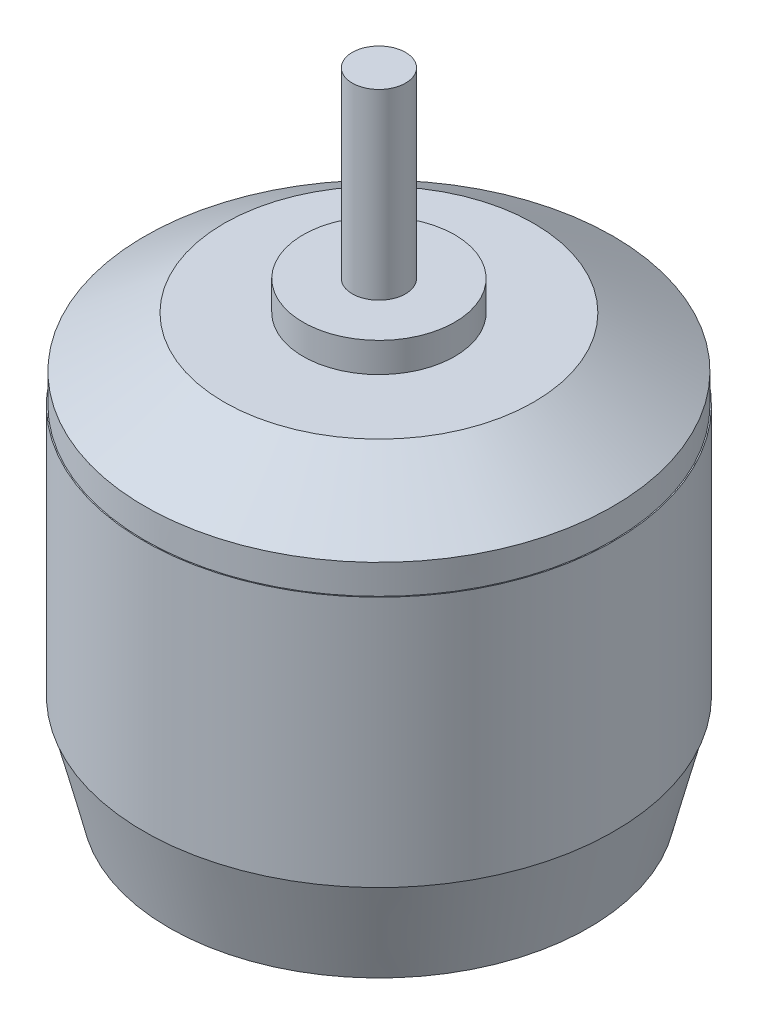
ISO-10303-21;
HEADER;
FILE_DESCRIPTION(('STEP AP214'),'2;1');
FILE_NAME('part.step','',(''),(''),'','','');
FILE_SCHEMA(('AUTOMOTIVE_DESIGN { 1 0 10303 214 1 1 1 1 }'));
ENDSEC;
DATA;
#1=APPLICATION_CONTEXT('core data for automotive mechanical design processes');
#2=APPLICATION_PROTOCOL_DEFINITION('international standard','automotive_design',2000,#1);
#3=PRODUCT_CONTEXT('',#1,'mechanical');
#4=PRODUCT('Part','Part','',(#3));
#5=PRODUCT_RELATED_PRODUCT_CATEGORY('part','',(#4));
#6=PRODUCT_DEFINITION_FORMATION('','',#4);
#7=PRODUCT_DEFINITION_CONTEXT('part definition',#1,'design');
#8=PRODUCT_DEFINITION('design','',#6,#7);
#9=PRODUCT_DEFINITION_SHAPE('','',#8);
#10=(LENGTH_UNIT() NAMED_UNIT(*) SI_UNIT(.MILLI.,.METRE.));
#11=(NAMED_UNIT(*) PLANE_ANGLE_UNIT() SI_UNIT($,.RADIAN.));
#12=(NAMED_UNIT(*) SI_UNIT($,.STERADIAN.) SOLID_ANGLE_UNIT());
#13=UNCERTAINTY_MEASURE_WITH_UNIT(LENGTH_MEASURE(1.E-05),#10,'distance_accuracy_value','');
#14=(GEOMETRIC_REPRESENTATION_CONTEXT(3) GLOBAL_UNCERTAINTY_ASSIGNED_CONTEXT((#13)) GLOBAL_UNIT_ASSIGNED_CONTEXT((#10,
#11,#12)) REPRESENTATION_CONTEXT('',''));
#15=CARTESIAN_POINT('',(0.,0.,0.));
#16=DIRECTION('',(0.,0.,1.));
#17=DIRECTION('',(1.,0.,0.));
#18=AXIS2_PLACEMENT_3D('',#15,#16,#17);
#19=CARTESIAN_POINT('',(0.,-72.3718100484437,0.));
#20=DIRECTION('',(0.,-1.,0.));
#21=DIRECTION('',(0.,0.,-1.));
#22=AXIS2_PLACEMENT_3D('',#19,#20,#21);
#23=CYLINDRICAL_SURFACE('',#22,13.843);
#24=CARTESIAN_POINT('',(0.,22.6187,0.));
#25=DIRECTION('',(0.,1.,0.));
#26=DIRECTION('',(0.,0.,1.));
#27=AXIS2_PLACEMENT_3D('',#24,#25,#26);
#28=CIRCLE('',#27,13.843);
#29=CARTESIAN_POINT('',(0.,22.6187,13.843));
#30=VERTEX_POINT('',#29);
#31=EDGE_CURVE('E11',#30,#30,#28,.F.);
#32=ORIENTED_EDGE('',*,*,#31,.F.);
#33=EDGE_LOOP('',(#32));
#34=FACE_BOUND('',#33,.T.);
#35=CARTESIAN_POINT('',(0.,24.3586,0.));
#36=DIRECTION('',(0.,-1.,0.));
#37=DIRECTION('',(0.,0.,-1.));
#38=AXIS2_PLACEMENT_3D('',#35,#36,#37);
#39=CIRCLE('',#38,13.843);
#40=CARTESIAN_POINT('',(0.,24.3586,-13.843));
#41=VERTEX_POINT('',#40);
#42=EDGE_CURVE('E122',#41,#41,#39,.T.);
#43=ORIENTED_EDGE('',*,*,#42,.T.);
#44=EDGE_LOOP('',(#43));
#45=FACE_BOUND('',#44,.T.);
#46=ADVANCED_FACE('F39',(#34,#45),#23,.T.);
#47=CARTESIAN_POINT('',(0.,24.3586,0.));
#48=DIRECTION('',(0.,-1.,0.));
#49=DIRECTION('',(0.,0.,-1.));
#50=AXIS2_PLACEMENT_3D('',#47,#48,#49);
#51=CONICAL_SURFACE('',#50,13.843,1.0017908043254);
#52=CARTESIAN_POINT('',(0.,27.3558,0.));
#53=DIRECTION('',(0.,-1.,0.));
#54=DIRECTION('',(0.,0.,-1.));
#55=AXIS2_PLACEMENT_3D('',#52,#53,#54);
#56=CIRCLE('',#55,9.1567);
#57=CARTESIAN_POINT('',(0.,27.3558,-9.1567));
#58=VERTEX_POINT('',#57);
#59=EDGE_CURVE('E119',#58,#58,#56,.T.);
#60=ORIENTED_EDGE('',*,*,#59,.T.);
#61=EDGE_LOOP('',(#60));
#62=FACE_BOUND('',#61,.T.);
#63=ORIENTED_EDGE('',*,*,#42,.F.);
#64=EDGE_LOOP('',(#63));
#65=FACE_BOUND('',#64,.T.);
#66=ADVANCED_FACE('F152',(#62,#65),#51,.T.);
#67=CARTESIAN_POINT('',(9.1567,27.3558,0.));
#68=DIRECTION('',(0.,1.,0.));
#69=DIRECTION('',(0.,0.,1.));
#70=AXIS2_PLACEMENT_3D('',#67,#68,#69);
#71=PLANE('',#70);
#72=CARTESIAN_POINT('',(0.,27.3558,0.));
#73=DIRECTION('',(0.,-1.,0.));
#74=DIRECTION('',(0.,0.,-1.));
#75=AXIS2_PLACEMENT_3D('',#72,#73,#74);
#76=CIRCLE('',#75,4.4831);
#77=CARTESIAN_POINT('',(0.,27.3558,-4.4831));
#78=VERTEX_POINT('',#77);
#79=EDGE_CURVE('E116',#78,#78,#76,.T.);
#80=ORIENTED_EDGE('',*,*,#79,.T.);
#81=EDGE_LOOP('',(#80));
#82=FACE_BOUND('',#81,.T.);
#83=ORIENTED_EDGE('',*,*,#59,.F.);
#84=EDGE_LOOP('',(#83));
#85=FACE_BOUND('',#84,.T.);
#86=ADVANCED_FACE('F158',(#82,#85),#71,.T.);
#87=CARTESIAN_POINT('',(0.,-72.3718100484437,0.));
#88=DIRECTION('',(0.,-1.,0.));
#89=DIRECTION('',(0.,0.,-1.));
#90=AXIS2_PLACEMENT_3D('',#87,#88,#89);
#91=CYLINDRICAL_SURFACE('',#90,4.4831);
#92=CARTESIAN_POINT('',(0.,29.1084,0.));
#93=DIRECTION('',(0.,-1.,0.));
#94=DIRECTION('',(0.,0.,-1.));
#95=AXIS2_PLACEMENT_3D('',#92,#93,#94);
#96=CIRCLE('',#95,4.4831);
#97=CARTESIAN_POINT('',(0.,29.1084,-4.4831));
#98=VERTEX_POINT('',#97);
#99=EDGE_CURVE('E113',#98,#98,#96,.T.);
#100=ORIENTED_EDGE('',*,*,#99,.T.);
#101=EDGE_LOOP('',(#100));
#102=FACE_BOUND('',#101,.T.);
#103=ORIENTED_EDGE('',*,*,#79,.F.);
#104=EDGE_LOOP('',(#103));
#105=FACE_BOUND('',#104,.T.);
#106=ADVANCED_FACE('F222',(#102,#105),#91,.T.);
#107=CARTESIAN_POINT('',(4.4831,29.1084,0.));
#108=DIRECTION('',(0.,1.,0.));
#109=DIRECTION('',(0.,0.,1.));
#110=AXIS2_PLACEMENT_3D('',#107,#108,#109);
#111=PLANE('',#110);
#112=CARTESIAN_POINT('',(0.,29.1084,0.));
#113=DIRECTION('',(0.,-1.,0.));
#114=DIRECTION('',(0.,0.,-1.));
#115=AXIS2_PLACEMENT_3D('',#112,#113,#114);
#116=CIRCLE('',#115,1.5748);
#117=CARTESIAN_POINT('',(0.,29.1084,-1.5748));
#118=VERTEX_POINT('',#117);
#119=EDGE_CURVE('E110',#118,#118,#116,.T.);
#120=ORIENTED_EDGE('',*,*,#119,.T.);
#121=EDGE_LOOP('',(#120));
#122=FACE_BOUND('',#121,.T.);
#123=ORIENTED_EDGE('',*,*,#99,.F.);
#124=EDGE_LOOP('',(#123));
#125=FACE_BOUND('',#124,.T.);
#126=ADVANCED_FACE('F218',(#122,#125),#111,.T.);
#127=CARTESIAN_POINT('',(0.,-72.3718100484437,0.));
#128=DIRECTION('',(0.,-1.,0.));
#129=DIRECTION('',(0.,0.,-1.));
#130=AXIS2_PLACEMENT_3D('',#127,#128,#129);
#131=CYLINDRICAL_SURFACE('',#130,1.5748);
#132=CARTESIAN_POINT('',(0.,39.9034,0.));
#133=DIRECTION('',(0.,-1.,0.));
#134=DIRECTION('',(0.,0.,-1.));
#135=AXIS2_PLACEMENT_3D('',#132,#133,#134);
#136=CIRCLE('',#135,1.5748);
#137=CARTESIAN_POINT('',(0.,39.9034,-1.5748));
#138=VERTEX_POINT('',#137);
#139=EDGE_CURVE('E107',#138,#138,#136,.T.);
#140=ORIENTED_EDGE('',*,*,#139,.T.);
#141=EDGE_LOOP('',(#140));
#142=FACE_BOUND('',#141,.T.);
#143=ORIENTED_EDGE('',*,*,#119,.F.);
#144=EDGE_LOOP('',(#143));
#145=FACE_BOUND('',#144,.T.);
#146=ADVANCED_FACE('F214',(#142,#145),#131,.T.);
#147=CARTESIAN_POINT('',(1.5748,39.9034,0.));
#148=DIRECTION('',(0.,1.,0.));
#149=DIRECTION('',(0.,0.,1.));
#150=AXIS2_PLACEMENT_3D('',#147,#148,#149);
#151=PLANE('',#150);
#152=ORIENTED_EDGE('',*,*,#139,.F.);
#153=EDGE_LOOP('',(#152));
#154=FACE_BOUND('',#153,.T.);
#155=ADVANCED_FACE('F210',(#154),#151,.T.);
#156=CARTESIAN_POINT('',(0.,7.747,0.));
#157=DIRECTION('',(0.,-1.,0.));
#158=DIRECTION('',(0.,0.,-1.));
#159=AXIS2_PLACEMENT_3D('',#156,#157,#158);
#160=PLANE('',#159);
#161=CARTESIAN_POINT('',(0.,7.747,0.));
#162=DIRECTION('',(0.,-1.,0.));
#163=DIRECTION('',(0.,0.,-1.));
#164=AXIS2_PLACEMENT_3D('',#161,#162,#163);
#165=CIRCLE('',#164,13.843);
#166=CARTESIAN_POINT('',(0.,7.747,-13.843));
#167=VERTEX_POINT('',#166);
#168=EDGE_CURVE('E80',#167,#167,#165,.F.);
#169=ORIENTED_EDGE('',*,*,#168,.T.);
#170=EDGE_LOOP('',(#169));
#171=FACE_BOUND('',#170,.T.);
#172=CARTESIAN_POINT('',(0.,7.747,0.));
#173=DIRECTION('',(0.,-1.,0.));
#174=DIRECTION('',(0.,0.,-1.));
#175=AXIS2_PLACEMENT_3D('',#172,#173,#174);
#176=CIRCLE('',#175,13.9065);
#177=CARTESIAN_POINT('',(0.,7.747,-13.9065));
#178=VERTEX_POINT('',#177);
#179=EDGE_CURVE('E61',#178,#178,#176,.T.);
#180=ORIENTED_EDGE('',*,*,#179,.T.);
#181=EDGE_LOOP('',(#180));
#182=FACE_BOUND('',#181,.T.);
#183=ADVANCED_FACE('F213',(#171,#182),#160,.T.);
#184=CARTESIAN_POINT('',(0.,-72.3718100484437,0.));
#185=DIRECTION('',(0.,-1.,0.));
#186=DIRECTION('',(0.,0.,-1.));
#187=AXIS2_PLACEMENT_3D('',#184,#185,#186);
#188=CYLINDRICAL_SURFACE('',#187,13.9065);
#189=CARTESIAN_POINT('',(0.,22.6187,0.));
#190=DIRECTION('',(0.,-1.,0.));
#191=DIRECTION('',(0.,0.,-1.));
#192=AXIS2_PLACEMENT_3D('',#189,#190,#191);
#193=CIRCLE('',#192,13.9065);
#194=CARTESIAN_POINT('',(0.,22.6187,-13.9065));
#195=VERTEX_POINT('',#194);
#196=EDGE_CURVE('E68',#195,#195,#193,.T.);
#197=ORIENTED_EDGE('',*,*,#196,.T.);
#198=EDGE_LOOP('',(#197));
#199=FACE_BOUND('',#198,.T.);
#200=ORIENTED_EDGE('',*,*,#179,.F.);
#201=EDGE_LOOP('',(#200));
#202=FACE_BOUND('',#201,.T.);
#203=ADVANCED_FACE('F261',(#199,#202),#188,.T.);
#204=CARTESIAN_POINT('',(0.,22.6187,0.));
#205=DIRECTION('',(0.,1.,0.));
#206=DIRECTION('',(0.,0.,1.));
#207=AXIS2_PLACEMENT_3D('',#204,#205,#206);
#208=PLANE('',#207);
#209=ORIENTED_EDGE('',*,*,#31,.T.);
#210=EDGE_LOOP('',(#209));
#211=FACE_BOUND('',#210,.T.);
#212=ORIENTED_EDGE('',*,*,#196,.F.);
#213=EDGE_LOOP('',(#212));
#214=FACE_BOUND('',#213,.T.);
#215=ADVANCED_FACE('F272',(#211,#214),#208,.T.);
#216=CARTESIAN_POINT('',(0.,0.,0.));
#217=DIRECTION('',(0.,-1.,0.));
#218=DIRECTION('',(0.,0.,-1.));
#219=AXIS2_PLACEMENT_3D('',#216,#217,#218);
#220=PLANE('',#219);
#221=CARTESIAN_POINT('',(0.,0.,0.));
#222=DIRECTION('',(0.,-1.,0.));
#223=DIRECTION('',(0.,0.,-1.));
#224=AXIS2_PLACEMENT_3D('',#221,#222,#223);
#225=CIRCLE('',#224,1.5748);
#226=CARTESIAN_POINT('',(0.,0.,-1.5748));
#227=VERTEX_POINT('',#226);
#228=EDGE_CURVE('E46',#227,#227,#225,.T.);
#229=ORIENTED_EDGE('',*,*,#228,.T.);
#230=EDGE_LOOP('',(#229));
#231=FACE_BOUND('',#230,.T.);
#232=ADVANCED_FACE('F41',(#231),#220,.T.);
#233=CARTESIAN_POINT('',(0.,-72.3718100484437,0.));
#234=DIRECTION('',(0.,-1.,0.));
#235=DIRECTION('',(0.,0.,-1.));
#236=AXIS2_PLACEMENT_3D('',#233,#234,#235);
#237=CYLINDRICAL_SURFACE('',#236,1.5748);
#238=CARTESIAN_POINT('',(0.,1.10490000000001,0.));
#239=DIRECTION('',(0.,-1.,0.));
#240=DIRECTION('',(0.,0.,-1.));
#241=AXIS2_PLACEMENT_3D('',#238,#239,#240);
#242=CIRCLE('',#241,1.5748);
#243=CARTESIAN_POINT('',(0.,1.10490000000001,-1.5748));
#244=VERTEX_POINT('',#243);
#245=EDGE_CURVE('E50',#244,#244,#242,.T.);
#246=ORIENTED_EDGE('',*,*,#245,.T.);
#247=EDGE_LOOP('',(#246));
#248=FACE_BOUND('',#247,.T.);
#249=ORIENTED_EDGE('',*,*,#228,.F.);
#250=EDGE_LOOP('',(#249));
#251=FACE_BOUND('',#250,.T.);
#252=ADVANCED_FACE('F148',(#248,#251),#237,.T.);
#253=CARTESIAN_POINT('',(1.5748,1.1049,0.));
#254=DIRECTION('',(0.,-1.,0.));
#255=DIRECTION('',(0.,0.,-1.));
#256=AXIS2_PLACEMENT_3D('',#253,#254,#255);
#257=PLANE('',#256);
#258=CARTESIAN_POINT('',(0.,1.10490000000001,0.));
#259=DIRECTION('',(0.,-1.,0.));
#260=DIRECTION('',(0.,0.,-1.));
#261=AXIS2_PLACEMENT_3D('',#258,#259,#260);
#262=CIRCLE('',#261,3.0099);
#263=CARTESIAN_POINT('',(0.,1.10490000000001,-3.0099));
#264=VERTEX_POINT('',#263);
#265=EDGE_CURVE('E55',#264,#264,#262,.T.);
#266=ORIENTED_EDGE('',*,*,#265,.T.);
#267=EDGE_LOOP('',(#266));
#268=FACE_BOUND('',#267,.T.);
#269=ORIENTED_EDGE('',*,*,#245,.F.);
#270=EDGE_LOOP('',(#269));
#271=FACE_BOUND('',#270,.T.);
#272=ADVANCED_FACE('F133',(#268,#271),#257,.T.);
#273=CARTESIAN_POINT('',(0.,-72.3718100484437,0.));
#274=DIRECTION('',(0.,-1.,0.));
#275=DIRECTION('',(0.,0.,-1.));
#276=AXIS2_PLACEMENT_3D('',#273,#274,#275);
#277=CYLINDRICAL_SURFACE('',#276,3.0099);
#278=CARTESIAN_POINT('',(0.,2.0574,0.));
#279=DIRECTION('',(0.,-1.,0.));
#280=DIRECTION('',(0.,0.,-1.));
#281=AXIS2_PLACEMENT_3D('',#278,#279,#280);
#282=CIRCLE('',#281,3.0099);
#283=CARTESIAN_POINT('',(0.,2.0574,-3.0099));
#284=VERTEX_POINT('',#283);
#285=EDGE_CURVE('E128',#284,#284,#282,.T.);
#286=ORIENTED_EDGE('',*,*,#285,.T.);
#287=EDGE_LOOP('',(#286));
#288=FACE_BOUND('',#287,.T.);
#289=ORIENTED_EDGE('',*,*,#265,.F.);
#290=EDGE_LOOP('',(#289));
#291=FACE_BOUND('',#290,.T.);
#292=ADVANCED_FACE('F136',(#288,#291),#277,.T.);
#293=CARTESIAN_POINT('',(8.,2.0574,0.));
#294=DIRECTION('',(0.,-1.,0.));
#295=DIRECTION('',(0.,0.,-1.));
#296=AXIS2_PLACEMENT_3D('',#293,#294,#295);
#297=CONICAL_SURFACE('',#296,1.525,0.785398163397444);
#298=CARTESIAN_POINT('',(8.,2.3324,0.));
#299=DIRECTION('',(0.,-1.,0.));
#300=DIRECTION('',(0.,0.,-1.));
#301=AXIS2_PLACEMENT_3D('',#298,#299,#300);
#302=CIRCLE('',#301,1.25);
#303=CARTESIAN_POINT('',(8.,2.3324,-1.25));
#304=VERTEX_POINT('',#303);
#305=EDGE_CURVE('E104',#304,#304,#302,.T.);
#306=ORIENTED_EDGE('',*,*,#305,.F.);
#307=EDGE_LOOP('',(#306));
#308=FACE_BOUND('',#307,.T.);
#309=CARTESIAN_POINT('',(8.,2.0574,0.));
#310=DIRECTION('',(0.,-1.,0.));
#311=DIRECTION('',(0.,0.,-1.));
#312=AXIS2_PLACEMENT_3D('',#309,#310,#311);
#313=CIRCLE('',#312,1.525);
#314=CARTESIAN_POINT('',(8.,2.0574,-1.525));
#315=VERTEX_POINT('',#314);
#316=EDGE_CURVE('E101',#315,#315,#313,.T.);
#317=ORIENTED_EDGE('',*,*,#316,.T.);
#318=EDGE_LOOP('',(#317));
#319=FACE_BOUND('',#318,.T.);
#320=ADVANCED_FACE('F138',(#308,#319),#297,.F.);
#321=CARTESIAN_POINT('',(8.,2.0574,0.));
#322=DIRECTION('',(0.,-1.,0.));
#323=DIRECTION('',(0.,0.,-1.));
#324=AXIS2_PLACEMENT_3D('',#321,#322,#323);
#325=CYLINDRICAL_SURFACE('',#324,1.24999999999999);
#326=CARTESIAN_POINT('',(8.,7.747,0.));
#327=DIRECTION('',(0.,-1.,0.));
#328=DIRECTION('',(0.,0.,-1.));
#329=AXIS2_PLACEMENT_3D('',#326,#327,#328);
#330=CIRCLE('',#329,1.24999999999999);
#331=CARTESIAN_POINT('',(8.,7.747,-1.24999999999999));
#332=VERTEX_POINT('',#331);
#333=EDGE_CURVE('E77',#332,#332,#330,.F.);
#334=ORIENTED_EDGE('',*,*,#333,.T.);
#335=EDGE_LOOP('',(#334));
#336=FACE_BOUND('',#335,.T.);
#337=ORIENTED_EDGE('',*,*,#305,.T.);
#338=EDGE_LOOP('',(#337));
#339=FACE_BOUND('',#338,.T.);
#340=ADVANCED_FACE('F145',(#336,#339),#325,.F.);
#341=CARTESIAN_POINT('',(-8.,2.0574,0.));
#342=DIRECTION('',(0.,-1.,0.));
#343=DIRECTION('',(0.,0.,-1.));
#344=AXIS2_PLACEMENT_3D('',#341,#342,#343);
#345=CONICAL_SURFACE('',#344,1.525,0.785398163397444);
#346=CARTESIAN_POINT('',(-8.,2.3324,0.));
#347=DIRECTION('',(0.,-1.,0.));
#348=DIRECTION('',(0.,0.,-1.));
#349=AXIS2_PLACEMENT_3D('',#346,#347,#348);
#350=CIRCLE('',#349,1.25);
#351=CARTESIAN_POINT('',(-8.,2.3324,-1.25));
#352=VERTEX_POINT('',#351);
#353=EDGE_CURVE('E98',#352,#352,#350,.T.);
#354=ORIENTED_EDGE('',*,*,#353,.F.);
#355=EDGE_LOOP('',(#354));
#356=FACE_BOUND('',#355,.T.);
#357=CARTESIAN_POINT('',(-8.,2.0574,0.));
#358=DIRECTION('',(0.,-1.,0.));
#359=DIRECTION('',(0.,0.,-1.));
#360=AXIS2_PLACEMENT_3D('',#357,#358,#359);
#361=CIRCLE('',#360,1.525);
#362=CARTESIAN_POINT('',(-8.,2.0574,-1.525));
#363=VERTEX_POINT('',#362);
#364=EDGE_CURVE('E95',#363,#363,#361,.T.);
#365=ORIENTED_EDGE('',*,*,#364,.T.);
#366=EDGE_LOOP('',(#365));
#367=FACE_BOUND('',#366,.T.);
#368=ADVANCED_FACE('F191',(#356,#367),#345,.F.);
#369=CARTESIAN_POINT('',(-8.,2.0574,0.));
#370=DIRECTION('',(0.,-1.,0.));
#371=DIRECTION('',(0.,0.,-1.));
#372=AXIS2_PLACEMENT_3D('',#369,#370,#371);
#373=CYLINDRICAL_SURFACE('',#372,1.24999999999999);
#374=CARTESIAN_POINT('',(-8.,7.747,0.));
#375=DIRECTION('',(0.,-1.,0.));
#376=DIRECTION('',(0.,0.,-1.));
#377=AXIS2_PLACEMENT_3D('',#374,#375,#376);
#378=CIRCLE('',#377,1.24999999999999);
#379=CARTESIAN_POINT('',(-8.,7.747,-1.24999999999999));
#380=VERTEX_POINT('',#379);
#381=EDGE_CURVE('E65',#380,#380,#378,.F.);
#382=ORIENTED_EDGE('',*,*,#381,.T.);
#383=EDGE_LOOP('',(#382));
#384=FACE_BOUND('',#383,.T.);
#385=ORIENTED_EDGE('',*,*,#353,.T.);
#386=EDGE_LOOP('',(#385));
#387=FACE_BOUND('',#386,.T.);
#388=ADVANCED_FACE('F193',(#384,#387),#373,.F.);
#389=CARTESIAN_POINT('',(0.,2.0574,9.5));
#390=DIRECTION('',(0.,-1.,0.));
#391=DIRECTION('',(0.,0.,-1.));
#392=AXIS2_PLACEMENT_3D('',#389,#390,#391);
#393=CONICAL_SURFACE('',#392,1.525,0.78539816339747);
#394=CARTESIAN_POINT('',(0.,2.3324,9.5));
#395=DIRECTION('',(0.,-1.,0.));
#396=DIRECTION('',(0.,0.,-1.));
#397=AXIS2_PLACEMENT_3D('',#394,#395,#396);
#398=CIRCLE('',#397,1.24999999999999);
#399=CARTESIAN_POINT('',(0.,2.3324,8.25000000000001));
#400=VERTEX_POINT('',#399);
#401=EDGE_CURVE('E92',#400,#400,#398,.T.);
#402=ORIENTED_EDGE('',*,*,#401,.F.);
#403=EDGE_LOOP('',(#402));
#404=FACE_BOUND('',#403,.T.);
#405=CARTESIAN_POINT('',(0.,2.0574,9.5));
#406=DIRECTION('',(0.,-1.,0.));
#407=DIRECTION('',(0.,0.,-1.));
#408=AXIS2_PLACEMENT_3D('',#405,#406,#407);
#409=CIRCLE('',#408,1.525);
#410=CARTESIAN_POINT('',(0.,2.0574,7.975));
#411=VERTEX_POINT('',#410);
#412=EDGE_CURVE('E89',#411,#411,#409,.T.);
#413=ORIENTED_EDGE('',*,*,#412,.T.);
#414=EDGE_LOOP('',(#413));
#415=FACE_BOUND('',#414,.T.);
#416=ADVANCED_FACE('F200',(#404,#415),#393,.F.);
#417=CARTESIAN_POINT('',(0.,2.0574,9.5));
#418=DIRECTION('',(0.,-1.,0.));
#419=DIRECTION('',(0.,0.,-1.));
#420=AXIS2_PLACEMENT_3D('',#417,#418,#419);
#421=CYLINDRICAL_SURFACE('',#420,1.24999999999999);
#422=CARTESIAN_POINT('',(0.,7.747,9.5));
#423=DIRECTION('',(0.,-1.,0.));
#424=DIRECTION('',(0.,0.,-1.));
#425=AXIS2_PLACEMENT_3D('',#422,#423,#424);
#426=CIRCLE('',#425,1.24999999999999);
#427=CARTESIAN_POINT('',(0.,7.747,8.25000000000001));
#428=VERTEX_POINT('',#427);
#429=EDGE_CURVE('E60',#428,#428,#426,.F.);
#430=ORIENTED_EDGE('',*,*,#429,.T.);
#431=EDGE_LOOP('',(#430));
#432=FACE_BOUND('',#431,.T.);
#433=ORIENTED_EDGE('',*,*,#401,.T.);
#434=EDGE_LOOP('',(#433));
#435=FACE_BOUND('',#434,.T.);
#436=ADVANCED_FACE('F207',(#432,#435),#421,.F.);
#437=CARTESIAN_POINT('',(0.,2.0574,-9.5));
#438=DIRECTION('',(0.,-1.,0.));
#439=DIRECTION('',(0.,0.,-1.));
#440=AXIS2_PLACEMENT_3D('',#437,#438,#439);
#441=CONICAL_SURFACE('',#440,1.525,0.78539816339747);
#442=CARTESIAN_POINT('',(0.,2.3324,-9.5));
#443=DIRECTION('',(0.,-1.,0.));
#444=DIRECTION('',(0.,0.,-1.));
#445=AXIS2_PLACEMENT_3D('',#442,#443,#444);
#446=CIRCLE('',#445,1.24999999999999);
#447=CARTESIAN_POINT('',(0.,2.3324,-10.75));
#448=VERTEX_POINT('',#447);
#449=EDGE_CURVE('E86',#448,#448,#446,.T.);
#450=ORIENTED_EDGE('',*,*,#449,.F.);
#451=EDGE_LOOP('',(#450));
#452=FACE_BOUND('',#451,.T.);
#453=CARTESIAN_POINT('',(0.,2.0574,-9.5));
#454=DIRECTION('',(0.,-1.,0.));
#455=DIRECTION('',(0.,0.,-1.));
#456=AXIS2_PLACEMENT_3D('',#453,#454,#455);
#457=CIRCLE('',#456,1.525);
#458=CARTESIAN_POINT('',(0.,2.0574,-11.025));
#459=VERTEX_POINT('',#458);
#460=EDGE_CURVE('E83',#459,#459,#457,.T.);
#461=ORIENTED_EDGE('',*,*,#460,.T.);
#462=EDGE_LOOP('',(#461));
#463=FACE_BOUND('',#462,.T.);
#464=ADVANCED_FACE('F175',(#452,#463),#441,.F.);
#465=CARTESIAN_POINT('',(0.,2.0574,-9.5));
#466=DIRECTION('',(0.,-1.,0.));
#467=DIRECTION('',(0.,0.,-1.));
#468=AXIS2_PLACEMENT_3D('',#465,#466,#467);
#469=CYLINDRICAL_SURFACE('',#468,1.24999999999999);
#470=CARTESIAN_POINT('',(0.,7.747,-9.5));
#471=DIRECTION('',(0.,-1.,0.));
#472=DIRECTION('',(0.,0.,-1.));
#473=AXIS2_PLACEMENT_3D('',#470,#471,#472);
#474=CIRCLE('',#473,1.24999999999999);
#475=CARTESIAN_POINT('',(0.,7.747,-10.75));
#476=VERTEX_POINT('',#475);
#477=EDGE_CURVE('E58',#476,#476,#474,.F.);
#478=ORIENTED_EDGE('',*,*,#477,.T.);
#479=EDGE_LOOP('',(#478));
#480=FACE_BOUND('',#479,.T.);
#481=ORIENTED_EDGE('',*,*,#449,.T.);
#482=EDGE_LOOP('',(#481));
#483=FACE_BOUND('',#482,.T.);
#484=ADVANCED_FACE('F170',(#480,#483),#469,.F.);
#485=CARTESIAN_POINT('',(3.0099,2.0574,0.));
#486=DIRECTION('',(0.,-1.,0.));
#487=DIRECTION('',(0.,0.,-1.));
#488=AXIS2_PLACEMENT_3D('',#485,#486,#487);
#489=PLANE('',#488);
#490=ORIENTED_EDGE('',*,*,#460,.F.);
#491=EDGE_LOOP('',(#490));
#492=FACE_BOUND('',#491,.T.);
#493=ORIENTED_EDGE('',*,*,#412,.F.);
#494=EDGE_LOOP('',(#493));
#495=FACE_BOUND('',#494,.T.);
#496=ORIENTED_EDGE('',*,*,#364,.F.);
#497=EDGE_LOOP('',(#496));
#498=FACE_BOUND('',#497,.T.);
#499=ORIENTED_EDGE('',*,*,#316,.F.);
#500=EDGE_LOOP('',(#499));
#501=FACE_BOUND('',#500,.T.);
#502=CARTESIAN_POINT('',(0.,2.0574,0.));
#503=DIRECTION('',(0.,-1.,0.));
#504=DIRECTION('',(0.,0.,-1.));
#505=AXIS2_PLACEMENT_3D('',#502,#503,#504);
#506=CIRCLE('',#505,12.4079);
#507=CARTESIAN_POINT('',(0.,2.0574,-12.4079));
#508=VERTEX_POINT('',#507);
#509=EDGE_CURVE('E125',#508,#508,#506,.T.);
#510=ORIENTED_EDGE('',*,*,#509,.T.);
#511=EDGE_LOOP('',(#510));
#512=FACE_BOUND('',#511,.T.);
#513=ORIENTED_EDGE('',*,*,#285,.F.);
#514=EDGE_LOOP('',(#513));
#515=FACE_BOUND('',#514,.T.);
#516=ADVANCED_FACE('F167',(#492,#495,#498,#501,#512,#515),#489,.T.);
#517=CARTESIAN_POINT('',(0.,2.0574,0.));
#518=DIRECTION('',(0.,1.,0.));
#519=DIRECTION('',(0.,0.,1.));
#520=AXIS2_PLACEMENT_3D('',#517,#518,#519);
#521=CONICAL_SURFACE('',#520,12.4079,0.247078397573838);
#522=ORIENTED_EDGE('',*,*,#168,.F.);
#523=EDGE_LOOP('',(#522));
#524=FACE_BOUND('',#523,.T.);
#525=ORIENTED_EDGE('',*,*,#509,.F.);
#526=EDGE_LOOP('',(#525));
#527=FACE_BOUND('',#526,.T.);
#528=ADVANCED_FACE('F164',(#524,#527),#521,.T.);
#529=ORIENTED_EDGE('',*,*,#477,.F.);
#530=EDGE_LOOP('',(#529));
#531=FACE_BOUND('',#530,.T.);
#532=ADVANCED_FACE('F166',(#531),#160,.T.);
#533=ORIENTED_EDGE('',*,*,#429,.F.);
#534=EDGE_LOOP('',(#533));
#535=FACE_BOUND('',#534,.T.);
#536=ADVANCED_FACE('F432',(#535),#160,.T.);
#537=ORIENTED_EDGE('',*,*,#381,.F.);
#538=EDGE_LOOP('',(#537));
#539=FACE_BOUND('',#538,.T.);
#540=ADVANCED_FACE('F442',(#539),#160,.T.);
#541=ORIENTED_EDGE('',*,*,#333,.F.);
#542=EDGE_LOOP('',(#541));
#543=FACE_BOUND('',#542,.T.);
#544=ADVANCED_FACE('F264',(#543),#160,.T.);
#545=CLOSED_SHELL('',(#46,#66,#86,#106,#126,#146,#155,#183,#203,#215,#232,#252,#272,#292,#320,
#340,#368,#388,#416,#436,#464,#484,#516,#528,#532,#536,#540,#544));
#546=MANIFOLD_SOLID_BREP('B2',#545);
#547=ADVANCED_BREP_SHAPE_REPRESENTATION('',(#18,#546),#14);
#548=SHAPE_DEFINITION_REPRESENTATION(#9,#547);
ENDSEC;
END-ISO-10303-21;
